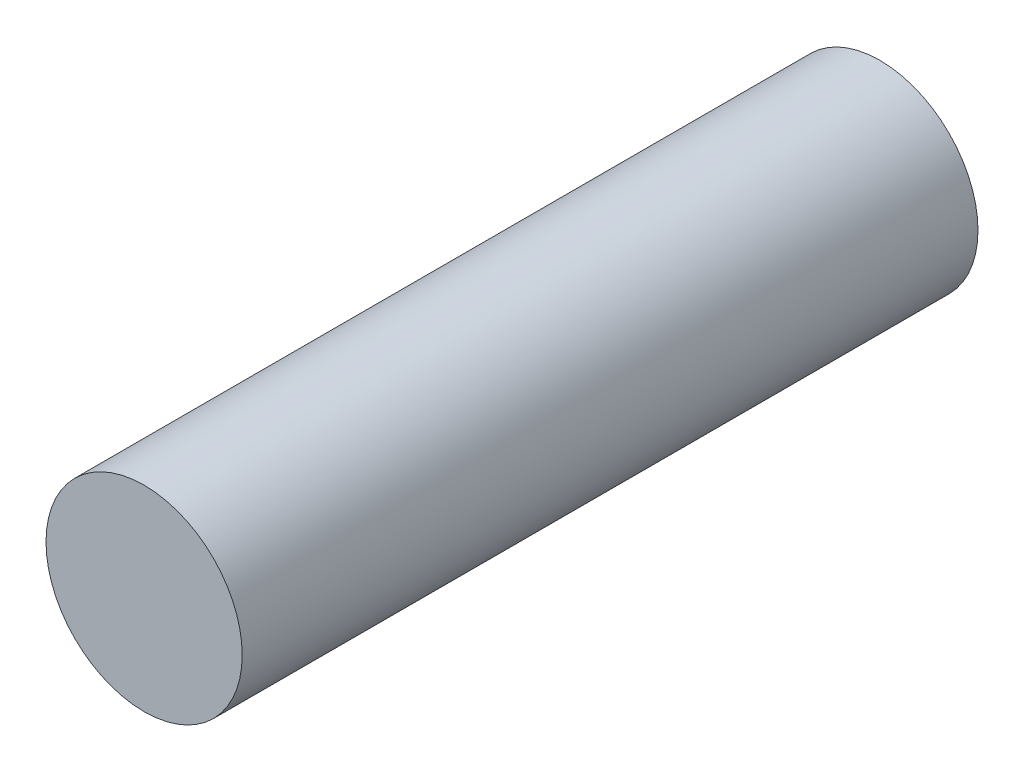
ISO-10303-21;
HEADER;
FILE_DESCRIPTION(('STEP AP214'),'2;1');
FILE_NAME('part.step','',(''),(''),'','','');
FILE_SCHEMA(('AUTOMOTIVE_DESIGN { 1 0 10303 214 1 1 1 1 }'));
ENDSEC;
DATA;
#1=APPLICATION_CONTEXT('core data for automotive mechanical design processes');
#2=APPLICATION_PROTOCOL_DEFINITION('international standard','automotive_design',2000,#1);
#3=PRODUCT_CONTEXT('',#1,'mechanical');
#4=PRODUCT('Part','Part','',(#3));
#5=PRODUCT_RELATED_PRODUCT_CATEGORY('part','',(#4));
#6=PRODUCT_DEFINITION_FORMATION('','',#4);
#7=PRODUCT_DEFINITION_CONTEXT('part definition',#1,'design');
#8=PRODUCT_DEFINITION('design','',#6,#7);
#9=PRODUCT_DEFINITION_SHAPE('','',#8);
#10=(LENGTH_UNIT() NAMED_UNIT(*) SI_UNIT(.MILLI.,.METRE.));
#11=(NAMED_UNIT(*) PLANE_ANGLE_UNIT() SI_UNIT($,.RADIAN.));
#12=(NAMED_UNIT(*) SI_UNIT($,.STERADIAN.) SOLID_ANGLE_UNIT());
#13=UNCERTAINTY_MEASURE_WITH_UNIT(LENGTH_MEASURE(1.E-05),#10,'distance_accuracy_value','');
#14=(GEOMETRIC_REPRESENTATION_CONTEXT(3) GLOBAL_UNCERTAINTY_ASSIGNED_CONTEXT((#13)) GLOBAL_UNIT_ASSIGNED_CONTEXT((#10,
#11,#12)) REPRESENTATION_CONTEXT('',''));
#15=CARTESIAN_POINT('',(0.,0.,0.));
#16=DIRECTION('',(0.,0.,1.));
#17=DIRECTION('',(1.,0.,0.));
#18=AXIS2_PLACEMENT_3D('',#15,#16,#17);
#19=CARTESIAN_POINT('',(0.,0.,7.5));
#20=DIRECTION('',(0.,0.,-1.));
#21=DIRECTION('',(-1.,0.,0.));
#22=AXIS2_PLACEMENT_3D('',#19,#20,#21);
#23=CYLINDRICAL_SURFACE('',#22,1.);
#24=CARTESIAN_POINT('',(0.,0.,7.5));
#25=DIRECTION('',(0.,0.,1.));
#26=DIRECTION('',(1.,0.,0.));
#27=AXIS2_PLACEMENT_3D('',#24,#25,#26);
#28=CIRCLE('',#27,1.);
#29=CARTESIAN_POINT('',(1.,0.,7.5));
#30=VERTEX_POINT('',#29);
#31=EDGE_CURVE('E10',#30,#30,#28,.T.);
#32=ORIENTED_EDGE('',*,*,#31,.F.);
#33=EDGE_LOOP('',(#32));
#34=FACE_BOUND('',#33,.T.);
#35=CARTESIAN_POINT('',(0.,0.,0.));
#36=DIRECTION('',(0.,0.,1.));
#37=DIRECTION('',(1.,0.,0.));
#38=AXIS2_PLACEMENT_3D('',#35,#36,#37);
#39=CIRCLE('',#38,1.);
#40=CARTESIAN_POINT('',(1.,0.,0.));
#41=VERTEX_POINT('',#40);
#42=EDGE_CURVE('E43',#41,#41,#39,.T.);
#43=ORIENTED_EDGE('',*,*,#42,.T.);
#44=EDGE_LOOP('',(#43));
#45=FACE_BOUND('',#44,.T.);
#46=ADVANCED_FACE('F40',(#34,#45),#23,.T.);
#47=CARTESIAN_POINT('',(0.,0.,7.5));
#48=DIRECTION('',(0.,0.,1.));
#49=DIRECTION('',(1.,0.,0.));
#50=AXIS2_PLACEMENT_3D('',#47,#48,#49);
#51=PLANE('',#50);
#52=ORIENTED_EDGE('',*,*,#31,.T.);
#53=EDGE_LOOP('',(#52));
#54=FACE_BOUND('',#53,.T.);
#55=ADVANCED_FACE('F57',(#54),#51,.T.);
#56=CARTESIAN_POINT('',(0.,0.,0.));
#57=DIRECTION('',(0.,0.,1.));
#58=DIRECTION('',(1.,0.,0.));
#59=AXIS2_PLACEMENT_3D('',#56,#57,#58);
#60=PLANE('',#59);
#61=ORIENTED_EDGE('',*,*,#42,.F.);
#62=EDGE_LOOP('',(#61));
#63=FACE_BOUND('',#62,.T.);
#64=ADVANCED_FACE('F55',(#63),#60,.F.);
#65=CLOSED_SHELL('',(#46,#55,#64));
#66=MANIFOLD_SOLID_BREP('B2',#65);
#67=ADVANCED_BREP_SHAPE_REPRESENTATION('',(#18,#66),#14);
#68=SHAPE_DEFINITION_REPRESENTATION(#9,#67);
ENDSEC;
END-ISO-10303-21;
